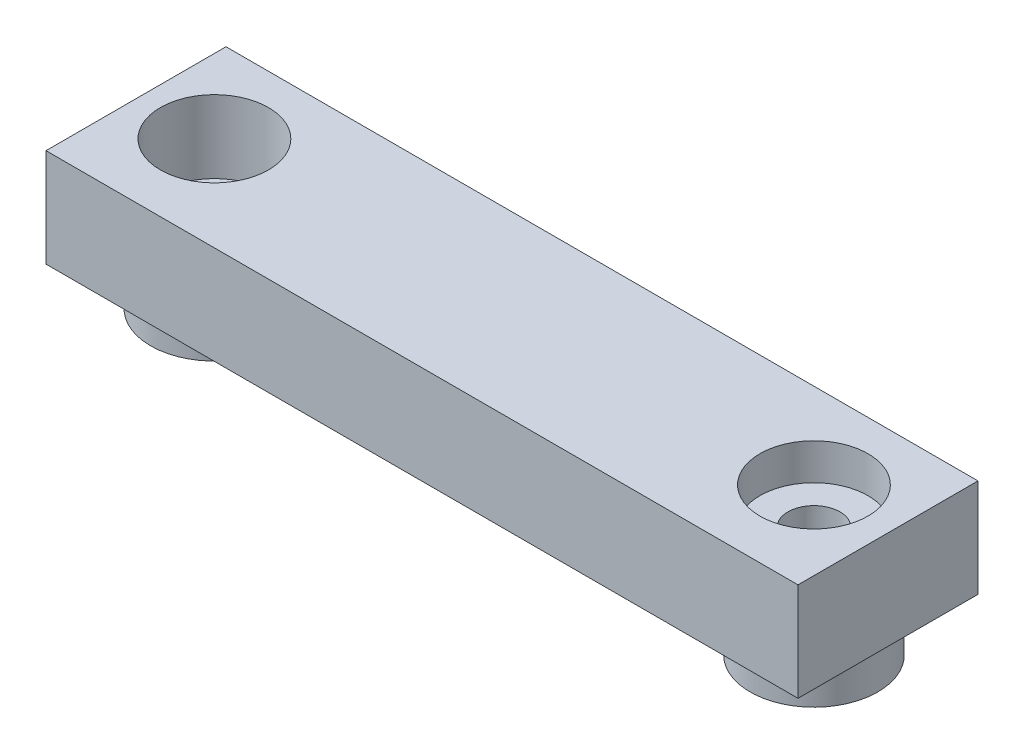
ISO-10303-21;
HEADER;
FILE_DESCRIPTION(('STEP AP214'),'2;1');
FILE_NAME('part.step','',(''),(''),'','','');
FILE_SCHEMA(('AUTOMOTIVE_DESIGN { 1 0 10303 214 1 1 1 1 }'));
ENDSEC;
DATA;
#1=APPLICATION_CONTEXT('core data for automotive mechanical design processes');
#2=APPLICATION_PROTOCOL_DEFINITION('international standard','automotive_design',2000,#1);
#3=PRODUCT_CONTEXT('',#1,'mechanical');
#4=PRODUCT('Part','Part','',(#3));
#5=PRODUCT_RELATED_PRODUCT_CATEGORY('part','',(#4));
#6=PRODUCT_DEFINITION_FORMATION('','',#4);
#7=PRODUCT_DEFINITION_CONTEXT('part definition',#1,'design');
#8=PRODUCT_DEFINITION('design','',#6,#7);
#9=PRODUCT_DEFINITION_SHAPE('','',#8);
#10=(LENGTH_UNIT() NAMED_UNIT(*) SI_UNIT(.MILLI.,.METRE.));
#11=(NAMED_UNIT(*) PLANE_ANGLE_UNIT() SI_UNIT($,.RADIAN.));
#12=(NAMED_UNIT(*) SI_UNIT($,.STERADIAN.) SOLID_ANGLE_UNIT());
#13=UNCERTAINTY_MEASURE_WITH_UNIT(LENGTH_MEASURE(1.E-05),#10,'distance_accuracy_value','');
#14=(GEOMETRIC_REPRESENTATION_CONTEXT(3) GLOBAL_UNCERTAINTY_ASSIGNED_CONTEXT((#13)) GLOBAL_UNIT_ASSIGNED_CONTEXT((#10,
#11,#12)) REPRESENTATION_CONTEXT('',''));
#15=CARTESIAN_POINT('',(0.,0.,0.));
#16=DIRECTION('',(0.,0.,1.));
#17=DIRECTION('',(1.,0.,0.));
#18=AXIS2_PLACEMENT_3D('',#15,#16,#17);
#19=CARTESIAN_POINT('',(-38.0175182720324,10.,-33.7828917931944));
#20=DIRECTION('',(1.,0.,0.));
#21=DIRECTION('',(0.,0.,-1.));
#22=AXIS2_PLACEMENT_3D('',#19,#20,#21);
#23=PLANE('',#22);
#24=DIRECTION('',(0.,0.,1.));
#25=VECTOR('',#24,1.);
#26=CARTESIAN_POINT('',(-38.0175182720324,0.,-33.7828917931944));
#27=LINE('',#26,#25);
#28=CARTESIAN_POINT('',(-38.0175182720324,0.,-33.7828917931944));
#29=VERTEX_POINT('',#28);
#30=CARTESIAN_POINT('',(-38.0175182720324,0.,-15.4682309624548));
#31=VERTEX_POINT('',#30);
#32=EDGE_CURVE('E107',#29,#31,#27,.T.);
#33=ORIENTED_EDGE('',*,*,#32,.T.);
#34=DIRECTION('',(0.,-1.,0.));
#35=VECTOR('',#34,1.);
#36=CARTESIAN_POINT('',(-38.0175182720324,10.,-15.4682309624548));
#37=LINE('',#36,#35);
#38=CARTESIAN_POINT('',(-38.0175182720324,10.,-15.4682309624548));
#39=VERTEX_POINT('',#38);
#40=EDGE_CURVE('E11',#39,#31,#37,.T.);
#41=ORIENTED_EDGE('',*,*,#40,.F.);
#42=DIRECTION('',(0.,0.,1.));
#43=VECTOR('',#42,1.);
#44=CARTESIAN_POINT('',(-38.0175182720324,10.,-33.7828917931944));
#45=LINE('',#44,#43);
#46=CARTESIAN_POINT('',(-38.0175182720324,10.,-33.7828917931944));
#47=VERTEX_POINT('',#46);
#48=EDGE_CURVE('E91',#47,#39,#45,.T.);
#49=ORIENTED_EDGE('',*,*,#48,.F.);
#50=DIRECTION('',(0.,-1.,0.));
#51=VECTOR('',#50,1.);
#52=CARTESIAN_POINT('',(-38.0175182720324,10.,-33.7828917931944));
#53=LINE('',#52,#51);
#54=EDGE_CURVE('E103',#47,#29,#53,.T.);
#55=ORIENTED_EDGE('',*,*,#54,.T.);
#56=EDGE_LOOP('',(#33,#41,#49,#55));
#57=FACE_BOUND('',#56,.T.);
#58=ADVANCED_FACE('F39',(#57),#23,.F.);
#59=CARTESIAN_POINT('',(-38.0175182720324,10.,-15.4682309624548));
#60=DIRECTION('',(0.,0.,-1.));
#61=DIRECTION('',(-1.,0.,0.));
#62=AXIS2_PLACEMENT_3D('',#59,#60,#61);
#63=PLANE('',#62);
#64=DIRECTION('',(1.,0.,0.));
#65=VECTOR('',#64,1.);
#66=CARTESIAN_POINT('',(-38.0175182720324,0.,-15.4682309624548));
#67=LINE('',#66,#65);
#68=CARTESIAN_POINT('',(38.4945004123312,0.,-15.4682309624548));
#69=VERTEX_POINT('',#68);
#70=EDGE_CURVE('E96',#31,#69,#67,.T.);
#71=ORIENTED_EDGE('',*,*,#70,.T.);
#72=DIRECTION('',(0.,-1.,0.));
#73=VECTOR('',#72,1.);
#74=CARTESIAN_POINT('',(38.4945004123312,10.,-15.4682309624548));
#75=LINE('',#74,#73);
#76=CARTESIAN_POINT('',(38.4945004123312,10.,-15.4682309624548));
#77=VERTEX_POINT('',#76);
#78=EDGE_CURVE('E48',#77,#69,#75,.T.);
#79=ORIENTED_EDGE('',*,*,#78,.F.);
#80=DIRECTION('',(1.,0.,0.));
#81=VECTOR('',#80,1.);
#82=CARTESIAN_POINT('',(-38.0175182720324,10.,-15.4682309624548));
#83=LINE('',#82,#81);
#84=EDGE_CURVE('E86',#39,#77,#83,.T.);
#85=ORIENTED_EDGE('',*,*,#84,.F.);
#86=ORIENTED_EDGE('',*,*,#40,.T.);
#87=EDGE_LOOP('',(#71,#79,#85,#86));
#88=FACE_BOUND('',#87,.T.);
#89=ADVANCED_FACE('F95',(#88),#63,.F.);
#90=CARTESIAN_POINT('',(38.4945004123312,10.,-33.7828917931944));
#91=DIRECTION('',(-1.,0.,0.));
#92=DIRECTION('',(0.,0.,1.));
#93=AXIS2_PLACEMENT_3D('',#90,#91,#92);
#94=PLANE('',#93);
#95=DIRECTION('',(0.,0.,-1.));
#96=VECTOR('',#95,1.);
#97=CARTESIAN_POINT('',(38.4945004123312,0.,-33.7828917931944));
#98=LINE('',#97,#96);
#99=CARTESIAN_POINT('',(38.4945004123312,0.,-33.7828917931944));
#100=VERTEX_POINT('',#99);
#101=EDGE_CURVE('E73',#69,#100,#98,.T.);
#102=ORIENTED_EDGE('',*,*,#101,.T.);
#103=DIRECTION('',(0.,-1.,0.));
#104=VECTOR('',#103,1.);
#105=CARTESIAN_POINT('',(38.4945004123312,10.,-33.7828917931944));
#106=LINE('',#105,#104);
#107=CARTESIAN_POINT('',(38.4945004123312,10.,-33.7828917931944));
#108=VERTEX_POINT('',#107);
#109=EDGE_CURVE('E98',#108,#100,#106,.T.);
#110=ORIENTED_EDGE('',*,*,#109,.F.);
#111=DIRECTION('',(0.,0.,-1.));
#112=VECTOR('',#111,1.);
#113=CARTESIAN_POINT('',(38.4945004123312,10.,-33.7828917931944));
#114=LINE('',#113,#112);
#115=EDGE_CURVE('E89',#77,#108,#114,.T.);
#116=ORIENTED_EDGE('',*,*,#115,.F.);
#117=ORIENTED_EDGE('',*,*,#78,.T.);
#118=EDGE_LOOP('',(#102,#110,#116,#117));
#119=FACE_BOUND('',#118,.T.);
#120=ADVANCED_FACE('F99',(#119),#94,.F.);
#121=CARTESIAN_POINT('',(-38.0175182720324,10.,-33.7828917931944));
#122=DIRECTION('',(0.,0.,1.));
#123=DIRECTION('',(1.,0.,0.));
#124=AXIS2_PLACEMENT_3D('',#121,#122,#123);
#125=PLANE('',#124);
#126=DIRECTION('',(-1.,0.,0.));
#127=VECTOR('',#126,1.);
#128=CARTESIAN_POINT('',(-38.0175182720324,0.,-33.7828917931944));
#129=LINE('',#128,#127);
#130=EDGE_CURVE('E79',#100,#29,#129,.T.);
#131=ORIENTED_EDGE('',*,*,#130,.T.);
#132=ORIENTED_EDGE('',*,*,#54,.F.);
#133=DIRECTION('',(-1.,0.,0.));
#134=VECTOR('',#133,1.);
#135=CARTESIAN_POINT('',(-38.0175182720324,10.,-33.7828917931944));
#136=LINE('',#135,#134);
#137=EDGE_CURVE('E56',#108,#47,#136,.T.);
#138=ORIENTED_EDGE('',*,*,#137,.F.);
#139=ORIENTED_EDGE('',*,*,#109,.T.);
#140=EDGE_LOOP('',(#131,#132,#138,#139));
#141=FACE_BOUND('',#140,.T.);
#142=ADVANCED_FACE('F121',(#141),#125,.F.);
#143=CARTESIAN_POINT('',(0.,10.,0.));
#144=DIRECTION('',(0.,1.,0.));
#145=DIRECTION('',(0.,0.,1.));
#146=AXIS2_PLACEMENT_3D('',#143,#144,#145);
#147=PLANE('',#146);
#148=CARTESIAN_POINT('',(30.5,10.,-25.0866338946936));
#149=DIRECTION('',(0.,1.,0.));
#150=DIRECTION('',(0.,0.,1.));
#151=AXIS2_PLACEMENT_3D('',#148,#149,#150);
#152=CIRCLE('',#151,5.49999999999999);
#153=CARTESIAN_POINT('',(30.5,10.,-19.5866338946936));
#154=VERTEX_POINT('',#153);
#155=EDGE_CURVE('E171',#154,#154,#152,.T.);
#156=ORIENTED_EDGE('',*,*,#155,.F.);
#157=EDGE_LOOP('',(#156));
#158=FACE_BOUND('',#157,.T.);
#159=CARTESIAN_POINT('',(-30.5,10.,-25.0866338946936));
#160=DIRECTION('',(0.,1.,0.));
#161=DIRECTION('',(0.,0.,1.));
#162=AXIS2_PLACEMENT_3D('',#159,#160,#161);
#163=CIRCLE('',#162,5.49999999999999);
#164=CARTESIAN_POINT('',(-30.5,10.,-19.5866338946936));
#165=VERTEX_POINT('',#164);
#166=EDGE_CURVE('E151',#165,#165,#163,.T.);
#167=ORIENTED_EDGE('',*,*,#166,.F.);
#168=EDGE_LOOP('',(#167));
#169=FACE_BOUND('',#168,.T.);
#170=ORIENTED_EDGE('',*,*,#48,.T.);
#171=ORIENTED_EDGE('',*,*,#84,.T.);
#172=ORIENTED_EDGE('',*,*,#115,.T.);
#173=ORIENTED_EDGE('',*,*,#137,.T.);
#174=EDGE_LOOP('',(#170,#171,#172,#173));
#175=FACE_BOUND('',#174,.T.);
#176=ADVANCED_FACE('F87',(#158,#169,#175),#147,.T.);
#177=CARTESIAN_POINT('',(0.,0.,0.));
#178=DIRECTION('',(0.,1.,0.));
#179=DIRECTION('',(0.,0.,1.));
#180=AXIS2_PLACEMENT_3D('',#177,#178,#179);
#181=PLANE('',#180);
#182=CARTESIAN_POINT('',(30.5,0.,-25.0866338946936));
#183=DIRECTION('',(0.,1.,0.));
#184=DIRECTION('',(0.,0.,-1.));
#185=AXIS2_PLACEMENT_3D('',#182,#183,#184);
#186=CIRCLE('',#185,6.50000000000001);
#187=CARTESIAN_POINT('',(30.5,0.,-31.5866338946936));
#188=VERTEX_POINT('',#187);
#189=EDGE_CURVE('E140',#188,#188,#186,.T.);
#190=ORIENTED_EDGE('',*,*,#189,.T.);
#191=EDGE_LOOP('',(#190));
#192=FACE_BOUND('',#191,.T.);
#193=CARTESIAN_POINT('',(-30.5,0.,-25.0866338946936));
#194=DIRECTION('',(0.,1.,0.));
#195=DIRECTION('',(0.,0.,1.));
#196=AXIS2_PLACEMENT_3D('',#193,#194,#195);
#197=CIRCLE('',#196,6.50000000000001);
#198=CARTESIAN_POINT('',(-30.5,0.,-18.5866338946936));
#199=VERTEX_POINT('',#198);
#200=EDGE_CURVE('E128',#199,#199,#197,.T.);
#201=ORIENTED_EDGE('',*,*,#200,.T.);
#202=EDGE_LOOP('',(#201));
#203=FACE_BOUND('',#202,.T.);
#204=ORIENTED_EDGE('',*,*,#32,.F.);
#205=ORIENTED_EDGE('',*,*,#130,.F.);
#206=ORIENTED_EDGE('',*,*,#101,.F.);
#207=ORIENTED_EDGE('',*,*,#70,.F.);
#208=EDGE_LOOP('',(#204,#205,#206,#207));
#209=FACE_BOUND('',#208,.T.);
#210=ADVANCED_FACE('F124',(#192,#203,#209),#181,.F.);
#211=CARTESIAN_POINT('',(-30.5,-5.,-25.0866338946936));
#212=DIRECTION('',(0.,1.,0.));
#213=DIRECTION('',(0.,0.,1.));
#214=AXIS2_PLACEMENT_3D('',#211,#212,#213);
#215=CYLINDRICAL_SURFACE('',#214,6.50000000000001);
#216=CARTESIAN_POINT('',(-30.5,-5.,-25.0866338946936));
#217=DIRECTION('',(0.,1.,0.));
#218=DIRECTION('',(0.,0.,1.));
#219=AXIS2_PLACEMENT_3D('',#216,#217,#218);
#220=CIRCLE('',#219,6.50000000000001);
#221=CARTESIAN_POINT('',(-30.5,-5.,-18.5866338946936));
#222=VERTEX_POINT('',#221);
#223=EDGE_CURVE('E111',#222,#222,#220,.T.);
#224=ORIENTED_EDGE('',*,*,#223,.T.);
#225=EDGE_LOOP('',(#224));
#226=FACE_BOUND('',#225,.T.);
#227=ORIENTED_EDGE('',*,*,#200,.F.);
#228=EDGE_LOOP('',(#227));
#229=FACE_BOUND('',#228,.T.);
#230=ADVANCED_FACE('F213',(#226,#229),#215,.T.);
#231=CARTESIAN_POINT('',(-30.5,-5.,-25.0866338946936));
#232=DIRECTION('',(0.,1.,0.));
#233=DIRECTION('',(0.,0.,1.));
#234=AXIS2_PLACEMENT_3D('',#231,#232,#233);
#235=PLANE('',#234);
#236=CARTESIAN_POINT('',(-30.5,-5.,-25.0866338946936));
#237=DIRECTION('',(0.,1.,0.));
#238=DIRECTION('',(0.,0.,1.));
#239=AXIS2_PLACEMENT_3D('',#236,#237,#238);
#240=CIRCLE('',#239,2.65);
#241=CARTESIAN_POINT('',(-30.5,-5.,-22.4366338946936));
#242=VERTEX_POINT('',#241);
#243=EDGE_CURVE('E132',#242,#242,#240,.T.);
#244=ORIENTED_EDGE('',*,*,#243,.T.);
#245=EDGE_LOOP('',(#244));
#246=FACE_BOUND('',#245,.T.);
#247=ORIENTED_EDGE('',*,*,#223,.F.);
#248=EDGE_LOOP('',(#247));
#249=FACE_BOUND('',#248,.T.);
#250=ADVANCED_FACE('F218',(#246,#249),#235,.F.);
#251=CARTESIAN_POINT('',(-30.5,-5.,-25.0866338946936));
#252=DIRECTION('',(0.,1.,0.));
#253=DIRECTION('',(0.,0.,1.));
#254=AXIS2_PLACEMENT_3D('',#251,#252,#253);
#255=CYLINDRICAL_SURFACE('',#254,2.65);
#256=CARTESIAN_POINT('',(-30.5,2.6,-25.0866338946936));
#257=DIRECTION('',(0.,1.,0.));
#258=DIRECTION('',(0.,0.,1.));
#259=AXIS2_PLACEMENT_3D('',#256,#257,#258);
#260=CIRCLE('',#259,2.65000000000001);
#261=CARTESIAN_POINT('',(-30.5,2.6,-22.4366338946936));
#262=VERTEX_POINT('',#261);
#263=EDGE_CURVE('E155',#262,#262,#260,.T.);
#264=ORIENTED_EDGE('',*,*,#263,.T.);
#265=EDGE_LOOP('',(#264));
#266=FACE_BOUND('',#265,.T.);
#267=ORIENTED_EDGE('',*,*,#243,.F.);
#268=EDGE_LOOP('',(#267));
#269=FACE_BOUND('',#268,.T.);
#270=ADVANCED_FACE('F222',(#266,#269),#255,.F.);
#271=CARTESIAN_POINT('',(30.5,-5.,-25.0866338946936));
#272=DIRECTION('',(0.,1.,0.));
#273=DIRECTION('',(0.,0.,1.));
#274=AXIS2_PLACEMENT_3D('',#271,#272,#273);
#275=CYLINDRICAL_SURFACE('',#274,6.50000000000001);
#276=CARTESIAN_POINT('',(30.5,-5.,-25.0866338946936));
#277=DIRECTION('',(0.,1.,0.));
#278=DIRECTION('',(0.,0.,-1.));
#279=AXIS2_PLACEMENT_3D('',#276,#277,#278);
#280=CIRCLE('',#279,6.50000000000001);
#281=CARTESIAN_POINT('',(30.5,-5.,-31.5866338946936));
#282=VERTEX_POINT('',#281);
#283=EDGE_CURVE('E139',#282,#282,#280,.T.);
#284=ORIENTED_EDGE('',*,*,#283,.T.);
#285=EDGE_LOOP('',(#284));
#286=FACE_BOUND('',#285,.T.);
#287=ORIENTED_EDGE('',*,*,#189,.F.);
#288=EDGE_LOOP('',(#287));
#289=FACE_BOUND('',#288,.T.);
#290=ADVANCED_FACE('F226',(#286,#289),#275,.T.);
#291=CARTESIAN_POINT('',(30.5,-5.,-25.0866338946936));
#292=DIRECTION('',(0.,-1.,0.));
#293=DIRECTION('',(0.,0.,-1.));
#294=AXIS2_PLACEMENT_3D('',#291,#292,#293);
#295=PLANE('',#294);
#296=CARTESIAN_POINT('',(30.5,-5.,-25.0866338946936));
#297=DIRECTION('',(0.,1.,0.));
#298=DIRECTION('',(0.,0.,-1.));
#299=AXIS2_PLACEMENT_3D('',#296,#297,#298);
#300=CIRCLE('',#299,2.65);
#301=CARTESIAN_POINT('',(30.5,-5.,-27.7366338946936));
#302=VERTEX_POINT('',#301);
#303=EDGE_CURVE('E144',#302,#302,#300,.T.);
#304=ORIENTED_EDGE('',*,*,#303,.T.);
#305=EDGE_LOOP('',(#304));
#306=FACE_BOUND('',#305,.T.);
#307=ORIENTED_EDGE('',*,*,#283,.F.);
#308=EDGE_LOOP('',(#307));
#309=FACE_BOUND('',#308,.T.);
#310=ADVANCED_FACE('F230',(#306,#309),#295,.T.);
#311=CARTESIAN_POINT('',(30.5,-5.,-25.0866338946936));
#312=DIRECTION('',(0.,1.,0.));
#313=DIRECTION('',(0.,0.,1.));
#314=AXIS2_PLACEMENT_3D('',#311,#312,#313);
#315=CYLINDRICAL_SURFACE('',#314,2.65);
#316=ORIENTED_EDGE('',*,*,#303,.F.);
#317=EDGE_LOOP('',(#316));
#318=FACE_BOUND('',#317,.T.);
#319=CARTESIAN_POINT('',(30.5,6.3,-25.0866338946936));
#320=DIRECTION('',(0.,1.,0.));
#321=DIRECTION('',(0.,0.,1.));
#322=AXIS2_PLACEMENT_3D('',#319,#320,#321);
#323=CIRCLE('',#322,2.65000000000001);
#324=CARTESIAN_POINT('',(30.5,6.3,-22.4366338946936));
#325=VERTEX_POINT('',#324);
#326=EDGE_CURVE('E163',#325,#325,#323,.T.);
#327=ORIENTED_EDGE('',*,*,#326,.T.);
#328=EDGE_LOOP('',(#327));
#329=FACE_BOUND('',#328,.T.);
#330=ADVANCED_FACE('F187',(#318,#329),#315,.F.);
#331=CARTESIAN_POINT('',(-30.5,10.,-25.0866338946936));
#332=DIRECTION('',(0.,1.,0.));
#333=DIRECTION('',(0.,0.,1.));
#334=AXIS2_PLACEMENT_3D('',#331,#332,#333);
#335=CYLINDRICAL_SURFACE('',#334,5.49999999999999);
#336=ORIENTED_EDGE('',*,*,#166,.T.);
#337=EDGE_LOOP('',(#336));
#338=FACE_BOUND('',#337,.T.);
#339=CARTESIAN_POINT('',(-30.5,2.6,-25.0866338946936));
#340=DIRECTION('',(0.,1.,0.));
#341=DIRECTION('',(0.,0.,1.));
#342=AXIS2_PLACEMENT_3D('',#339,#340,#341);
#343=CIRCLE('',#342,5.49999999999999);
#344=CARTESIAN_POINT('',(-30.5,2.6,-19.5866338946936));
#345=VERTEX_POINT('',#344);
#346=EDGE_CURVE('E159',#345,#345,#343,.T.);
#347=ORIENTED_EDGE('',*,*,#346,.F.);
#348=EDGE_LOOP('',(#347));
#349=FACE_BOUND('',#348,.T.);
#350=ADVANCED_FACE('F183',(#338,#349),#335,.F.);
#351=CARTESIAN_POINT('',(-27.85,2.6,-25.0866338946936));
#352=DIRECTION('',(0.,-1.,0.));
#353=DIRECTION('',(0.,0.,-1.));
#354=AXIS2_PLACEMENT_3D('',#351,#352,#353);
#355=PLANE('',#354);
#356=ORIENTED_EDGE('',*,*,#263,.F.);
#357=EDGE_LOOP('',(#356));
#358=FACE_BOUND('',#357,.T.);
#359=ORIENTED_EDGE('',*,*,#346,.T.);
#360=EDGE_LOOP('',(#359));
#361=FACE_BOUND('',#360,.T.);
#362=ADVANCED_FACE('F186',(#358,#361),#355,.F.);
#363=CARTESIAN_POINT('',(33.15,6.3,-25.0866338946936));
#364=DIRECTION('',(0.,-1.,0.));
#365=DIRECTION('',(0.,0.,-1.));
#366=AXIS2_PLACEMENT_3D('',#363,#364,#365);
#367=PLANE('',#366);
#368=ORIENTED_EDGE('',*,*,#326,.F.);
#369=EDGE_LOOP('',(#368));
#370=FACE_BOUND('',#369,.T.);
#371=CARTESIAN_POINT('',(30.5,6.3,-25.0866338946936));
#372=DIRECTION('',(0.,1.,0.));
#373=DIRECTION('',(0.,0.,1.));
#374=AXIS2_PLACEMENT_3D('',#371,#372,#373);
#375=CIRCLE('',#374,5.49999999999999);
#376=CARTESIAN_POINT('',(30.5,6.3,-19.5866338946936));
#377=VERTEX_POINT('',#376);
#378=EDGE_CURVE('E167',#377,#377,#375,.T.);
#379=ORIENTED_EDGE('',*,*,#378,.T.);
#380=EDGE_LOOP('',(#379));
#381=FACE_BOUND('',#380,.T.);
#382=ADVANCED_FACE('F192',(#370,#381),#367,.F.);
#383=CARTESIAN_POINT('',(30.5,10.,-25.0866338946936));
#384=DIRECTION('',(0.,1.,0.));
#385=DIRECTION('',(0.,0.,1.));
#386=AXIS2_PLACEMENT_3D('',#383,#384,#385);
#387=CYLINDRICAL_SURFACE('',#386,5.49999999999999);
#388=ORIENTED_EDGE('',*,*,#378,.F.);
#389=EDGE_LOOP('',(#388));
#390=FACE_BOUND('',#389,.T.);
#391=ORIENTED_EDGE('',*,*,#155,.T.);
#392=EDGE_LOOP('',(#391));
#393=FACE_BOUND('',#392,.T.);
#394=ADVANCED_FACE('F176',(#390,#393),#387,.F.);
#395=CLOSED_SHELL('',(#58,#89,#120,#142,#176,#210,#230,#250,#270,#290,#310,#330,#350,#362,#382,#394));
#396=MANIFOLD_SOLID_BREP('B2',#395);
#397=ADVANCED_BREP_SHAPE_REPRESENTATION('',(#18,#396),#14);
#398=SHAPE_DEFINITION_REPRESENTATION(#9,#397);
ENDSEC;
END-ISO-10303-21;
